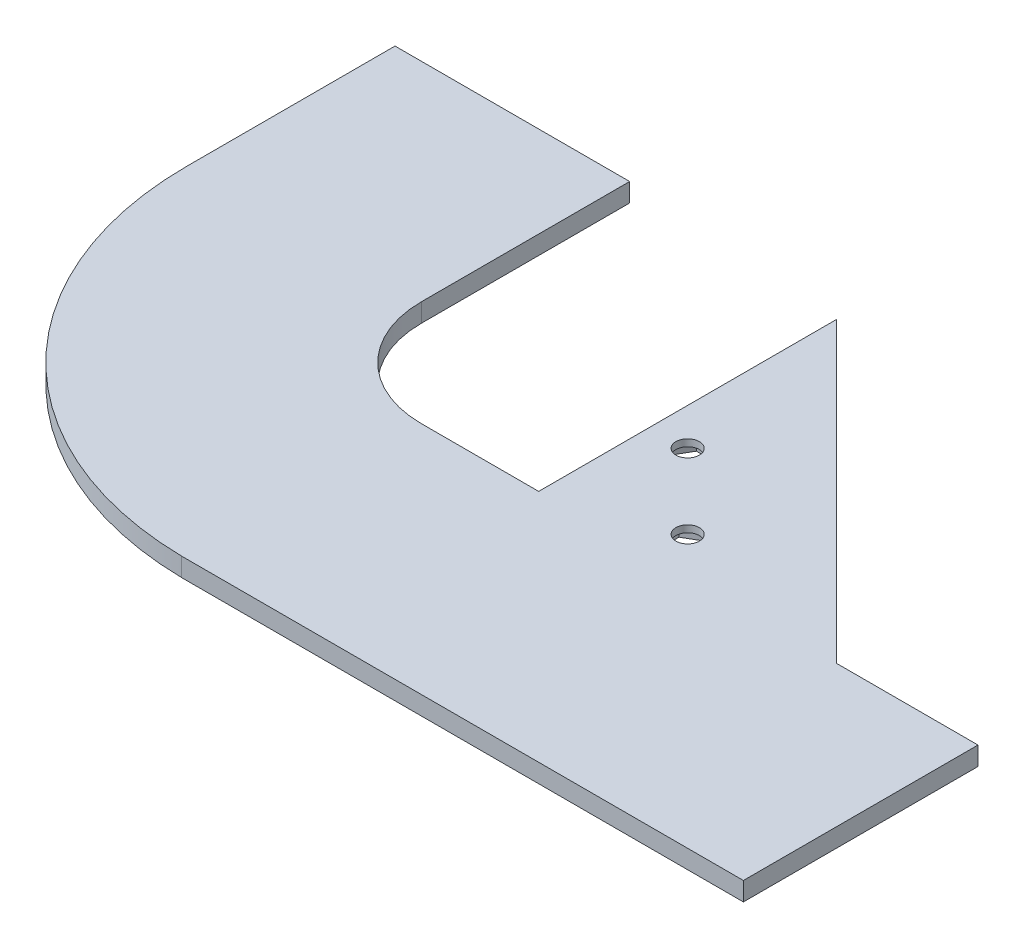
ISO-10303-21;
HEADER;
FILE_DESCRIPTION(('STEP AP214'),'2;1');
FILE_NAME('part.step','',(''),(''),'','','');
FILE_SCHEMA(('AUTOMOTIVE_DESIGN { 1 0 10303 214 1 1 1 1 }'));
ENDSEC;
DATA;
#1=APPLICATION_CONTEXT('core data for automotive mechanical design processes');
#2=APPLICATION_PROTOCOL_DEFINITION('international standard','automotive_design',2000,#1);
#3=PRODUCT_CONTEXT('',#1,'mechanical');
#4=PRODUCT('Part','Part','',(#3));
#5=PRODUCT_RELATED_PRODUCT_CATEGORY('part','',(#4));
#6=PRODUCT_DEFINITION_FORMATION('','',#4);
#7=PRODUCT_DEFINITION_CONTEXT('part definition',#1,'design');
#8=PRODUCT_DEFINITION('design','',#6,#7);
#9=PRODUCT_DEFINITION_SHAPE('','',#8);
#10=(LENGTH_UNIT() NAMED_UNIT(*) SI_UNIT(.MILLI.,.METRE.));
#11=(NAMED_UNIT(*) PLANE_ANGLE_UNIT() SI_UNIT($,.RADIAN.));
#12=(NAMED_UNIT(*) SI_UNIT($,.STERADIAN.) SOLID_ANGLE_UNIT());
#13=UNCERTAINTY_MEASURE_WITH_UNIT(LENGTH_MEASURE(1.E-05),#10,'distance_accuracy_value','');
#14=(GEOMETRIC_REPRESENTATION_CONTEXT(3) GLOBAL_UNCERTAINTY_ASSIGNED_CONTEXT((#13)) GLOBAL_UNIT_ASSIGNED_CONTEXT((#10,
#11,#12)) REPRESENTATION_CONTEXT('',''));
#15=CARTESIAN_POINT('',(0.,0.,0.));
#16=DIRECTION('',(0.,0.,1.));
#17=DIRECTION('',(1.,0.,0.));
#18=AXIS2_PLACEMENT_3D('',#15,#16,#17);
#19=CARTESIAN_POINT('',(0.,0.,0.));
#20=DIRECTION('',(0.,-1.,0.));
#21=DIRECTION('',(0.,0.,-1.));
#22=AXIS2_PLACEMENT_3D('',#19,#20,#21);
#23=PLANE('',#22);
#24=DIRECTION('',(-0.5,0.,-0.866025403784439));
#25=VECTOR('',#24,1.);
#26=CARTESIAN_POINT('',(9.98030738792827,0.,-5.76213315701559));
#27=LINE('',#26,#25);
#28=CARTESIAN_POINT('',(4.32927694458767,0.,-15.550005));
#29=VERTEX_POINT('',#28);
#30=CARTESIAN_POINT('',(2.30855388917533,0.,-19.05));
#31=VERTEX_POINT('',#30);
#32=EDGE_CURVE('E64',#29,#31,#27,.T.);
#33=ORIENTED_EDGE('',*,*,#32,.F.);
#34=DIRECTION('',(-1.,0.,0.));
#35=VECTOR('',#34,1.);
#36=CARTESIAN_POINT('',(0.,0.,-15.550005));
#37=LINE('',#36,#35);
#38=CARTESIAN_POINT('',(8.37072305541236,0.,-15.550005));
#39=VERTEX_POINT('',#38);
#40=EDGE_CURVE('E292',#39,#29,#37,.T.);
#41=ORIENTED_EDGE('',*,*,#40,.F.);
#42=DIRECTION('',(-0.5,0.,0.866025403784439));
#43=VECTOR('',#42,1.);
#44=CARTESIAN_POINT('',(-0.455307387928245,0.,-0.262871842984397));
#45=LINE('',#44,#43);
#46=CARTESIAN_POINT('',(10.3914461108247,0.,-19.05));
#47=VERTEX_POINT('',#46);
#48=EDGE_CURVE('E318',#47,#39,#45,.T.);
#49=ORIENTED_EDGE('',*,*,#48,.F.);
#50=DIRECTION('',(0.5,0.,0.866025403784439));
#51=VECTOR('',#50,1.);
#52=CARTESIAN_POINT('',(16.0424765541653,0.,-9.26212815701559));
#53=LINE('',#52,#51);
#54=CARTESIAN_POINT('',(8.37072305541236,0.,-22.549995));
#55=VERTEX_POINT('',#54);
#56=EDGE_CURVE('E315',#55,#47,#53,.T.);
#57=ORIENTED_EDGE('',*,*,#56,.F.);
#58=DIRECTION('',(1.,0.,0.));
#59=VECTOR('',#58,1.);
#60=CARTESIAN_POINT('',(0.,0.,-22.549995));
#61=LINE('',#60,#59);
#62=CARTESIAN_POINT('',(4.32927694458767,0.,-22.549995));
#63=VERTEX_POINT('',#62);
#64=EDGE_CURVE('E312',#63,#55,#61,.T.);
#65=ORIENTED_EDGE('',*,*,#64,.F.);
#66=DIRECTION('',(0.5,0.,-0.866025403784439));
#67=VECTOR('',#66,1.);
#68=CARTESIAN_POINT('',(-6.51747655416529,0.,-3.7628668429844));
#69=LINE('',#68,#67);
#70=EDGE_CURVE('E309',#31,#63,#69,.T.);
#71=ORIENTED_EDGE('',*,*,#70,.F.);
#72=EDGE_LOOP('',(#33,#41,#49,#57,#65,#71));
#73=FACE_BOUND('',#72,.T.);
#74=DIRECTION('',(-0.707106781186547,0.,-0.707106781186547));
#75=VECTOR('',#74,1.);
#76=CARTESIAN_POINT('',(50.8,0.,0.));
#77=LINE('',#76,#75);
#78=CARTESIAN_POINT('',(50.8,0.,0.));
#79=VERTEX_POINT('',#78);
#80=CARTESIAN_POINT('',(0.,0.,-50.8));
#81=VERTEX_POINT('',#80);
#82=EDGE_CURVE('E378',#79,#81,#77,.T.);
#83=ORIENTED_EDGE('',*,*,#82,.F.);
#84=DIRECTION('',(1.,0.,0.));
#85=VECTOR('',#84,1.);
#86=CARTESIAN_POINT('',(0.,0.,0.));
#87=LINE('',#86,#85);
#88=CARTESIAN_POINT('',(74.9046354694396,0.,0.));
#89=VERTEX_POINT('',#88);
#90=EDGE_CURVE('E254',#79,#89,#87,.T.);
#91=ORIENTED_EDGE('',*,*,#90,.T.);
#92=DIRECTION('',(0.,0.,1.));
#93=VECTOR('',#92,1.);
#94=CARTESIAN_POINT('',(74.9046354694396,0.,0.));
#95=LINE('',#94,#93);
#96=CARTESIAN_POINT('',(74.9046354694396,0.,40.));
#97=VERTEX_POINT('',#96);
#98=EDGE_CURVE('E223',#89,#97,#95,.T.);
#99=ORIENTED_EDGE('',*,*,#98,.T.);
#100=DIRECTION('',(-1.,0.,0.));
#101=VECTOR('',#100,1.);
#102=CARTESIAN_POINT('',(74.9046354694396,0.,40.));
#103=LINE('',#102,#101);
#104=CARTESIAN_POINT('',(-20.8712492348,0.,40.));
#105=VERTEX_POINT('',#104);
#106=EDGE_CURVE('E256',#97,#105,#103,.T.);
#107=ORIENTED_EDGE('',*,*,#106,.T.);
#108=CARTESIAN_POINT('',(-20.,0.,-18.));
#109=DIRECTION('',(0.,-1.,0.));
#110=DIRECTION('',(0.,0.,-1.));
#111=AXIS2_PLACEMENT_3D('',#108,#109,#110);
#112=CIRCLE('',#111,58.0065433828731);
#113=CARTESIAN_POINT('',(-78.0065433828731,0.,-18.));
#114=VERTEX_POINT('',#113);
#115=EDGE_CURVE('E259',#105,#114,#112,.T.);
#116=ORIENTED_EDGE('',*,*,#115,.T.);
#117=DIRECTION('',(0.,0.,-1.));
#118=VECTOR('',#117,1.);
#119=CARTESIAN_POINT('',(-78.0065433828731,0.,-53.5115102389505));
#120=LINE('',#119,#118);
#121=CARTESIAN_POINT('',(-78.0065433828731,0.,-53.5115102389505));
#122=VERTEX_POINT('',#121);
#123=EDGE_CURVE('E262',#114,#122,#120,.T.);
#124=ORIENTED_EDGE('',*,*,#123,.T.);
#125=DIRECTION('',(1.,0.,0.));
#126=VECTOR('',#125,1.);
#127=CARTESIAN_POINT('',(-38.,0.,-53.5115102389505));
#128=LINE('',#127,#126);
#129=CARTESIAN_POINT('',(-38.,0.,-53.5115102389505));
#130=VERTEX_POINT('',#129);
#131=EDGE_CURVE('E265',#122,#130,#128,.T.);
#132=ORIENTED_EDGE('',*,*,#131,.T.);
#133=DIRECTION('',(0.,0.,1.));
#134=VECTOR('',#133,1.);
#135=CARTESIAN_POINT('',(-38.,0.,-18.));
#136=LINE('',#135,#134);
#137=CARTESIAN_POINT('',(-38.,0.,-18.));
#138=VERTEX_POINT('',#137);
#139=EDGE_CURVE('E268',#130,#138,#136,.T.);
#140=ORIENTED_EDGE('',*,*,#139,.T.);
#141=CARTESIAN_POINT('',(-20.,0.,-18.));
#142=DIRECTION('',(0.,1.,0.));
#143=DIRECTION('',(0.,0.,-1.));
#144=AXIS2_PLACEMENT_3D('',#141,#142,#143);
#145=CIRCLE('',#144,18.);
#146=CARTESIAN_POINT('',(-20.,0.,0.));
#147=VERTEX_POINT('',#146);
#148=EDGE_CURVE('E216',#138,#147,#145,.T.);
#149=ORIENTED_EDGE('',*,*,#148,.T.);
#150=CARTESIAN_POINT('',(0.,0.,0.));
#151=VERTEX_POINT('',#150);
#152=EDGE_CURVE('E251',#147,#151,#87,.T.);
#153=ORIENTED_EDGE('',*,*,#152,.T.);
#154=DIRECTION('',(0.,0.,1.));
#155=VECTOR('',#154,1.);
#156=CARTESIAN_POINT('',(0.,0.,-50.8));
#157=LINE('',#156,#155);
#158=EDGE_CURVE('E385',#81,#151,#157,.T.);
#159=ORIENTED_EDGE('',*,*,#158,.F.);
#160=EDGE_LOOP('',(#83,#91,#99,#107,#116,#124,#132,#140,#149,#153,#159));
#161=FACE_BOUND('',#160,.T.);
#162=DIRECTION('',(0.,0.,1.));
#163=VECTOR('',#162,1.);
#164=CARTESIAN_POINT('',(15.550005,0.,0.));
#165=LINE('',#164,#163);
#166=CARTESIAN_POINT('',(15.550005,0.,-8.37072305541237));
#167=VERTEX_POINT('',#166);
#168=CARTESIAN_POINT('',(15.550005,0.,-4.32927694458767));
#169=VERTEX_POINT('',#168);
#170=EDGE_CURVE('E347',#167,#169,#165,.T.);
#171=ORIENTED_EDGE('',*,*,#170,.T.);
#172=DIRECTION('',(0.866025403784439,0.,0.499999999999999));
#173=VECTOR('',#172,1.);
#174=CARTESIAN_POINT('',(5.76213315701559,0.,-9.98030738792827));
#175=LINE('',#174,#173);
#176=CARTESIAN_POINT('',(19.05,0.,-2.30855388917533));
#177=VERTEX_POINT('',#176);
#178=EDGE_CURVE('E72',#169,#177,#175,.T.);
#179=ORIENTED_EDGE('',*,*,#178,.T.);
#180=DIRECTION('',(0.866025403784439,0.,-0.499999999999999));
#181=VECTOR('',#180,1.);
#182=CARTESIAN_POINT('',(3.76286684298438,0.,6.51747655416526));
#183=LINE('',#182,#181);
#184=CARTESIAN_POINT('',(22.549995,0.,-4.32927694458767));
#185=VERTEX_POINT('',#184);
#186=EDGE_CURVE('E360',#177,#185,#183,.T.);
#187=ORIENTED_EDGE('',*,*,#186,.T.);
#188=DIRECTION('',(0.,0.,-1.));
#189=VECTOR('',#188,1.);
#190=CARTESIAN_POINT('',(22.549995,0.,0.));
#191=LINE('',#190,#189);
#192=CARTESIAN_POINT('',(22.549995,0.,-8.37072305541236));
#193=VERTEX_POINT('',#192);
#194=EDGE_CURVE('E357',#185,#193,#191,.T.);
#195=ORIENTED_EDGE('',*,*,#194,.T.);
#196=DIRECTION('',(-0.866025403784439,0.,-0.5));
#197=VECTOR('',#196,1.);
#198=CARTESIAN_POINT('',(9.26212815701559,0.,-16.0424765541653));
#199=LINE('',#198,#197);
#200=CARTESIAN_POINT('',(19.05,0.,-10.3914461108247));
#201=VERTEX_POINT('',#200);
#202=EDGE_CURVE('E354',#193,#201,#199,.T.);
#203=ORIENTED_EDGE('',*,*,#202,.T.);
#204=DIRECTION('',(-0.866025403784439,0.,0.5));
#205=VECTOR('',#204,1.);
#206=CARTESIAN_POINT('',(0.262871842984393,0.,0.455307387928238));
#207=LINE('',#206,#205);
#208=EDGE_CURVE('E350',#201,#167,#207,.T.);
#209=ORIENTED_EDGE('',*,*,#208,.T.);
#210=EDGE_LOOP('',(#171,#179,#187,#195,#203,#209));
#211=FACE_BOUND('',#210,.T.);
#212=ADVANCED_FACE('F47',(#73,#161,#211),#23,.T.);
#213=CARTESIAN_POINT('',(6.35000000000002,0.,-19.05));
#214=DIRECTION('',(0.,1.,0.));
#215=DIRECTION('',(0.,0.,1.));
#216=AXIS2_PLACEMENT_3D('',#213,#214,#215);
#217=CYLINDRICAL_SURFACE('',#216,2.00000000000001);
#218=CARTESIAN_POINT('',(6.35000000000002,3.175,-19.05));
#219=DIRECTION('',(0.,-1.,0.));
#220=DIRECTION('',(0.,0.,-1.));
#221=AXIS2_PLACEMENT_3D('',#218,#219,#220);
#222=CIRCLE('',#221,2.00000000000001);
#223=CARTESIAN_POINT('',(6.35000000000002,3.175,-21.05));
#224=VERTEX_POINT('',#223);
#225=EDGE_CURVE('E379',#224,#224,#222,.T.);
#226=ORIENTED_EDGE('',*,*,#225,.F.);
#227=EDGE_LOOP('',(#226));
#228=FACE_BOUND('',#227,.T.);
#229=CARTESIAN_POINT('',(6.35000000000002,2.,-19.05));
#230=DIRECTION('',(0.,-1.,0.));
#231=DIRECTION('',(0.,0.,-1.));
#232=AXIS2_PLACEMENT_3D('',#229,#230,#231);
#233=CIRCLE('',#232,2.00000000000001);
#234=CARTESIAN_POINT('',(6.35000000000002,2.,-21.05));
#235=VERTEX_POINT('',#234);
#236=EDGE_CURVE('E51',#235,#235,#233,.T.);
#237=ORIENTED_EDGE('',*,*,#236,.T.);
#238=EDGE_LOOP('',(#237));
#239=FACE_BOUND('',#238,.T.);
#240=ADVANCED_FACE('F399',(#228,#239),#217,.F.);
#241=CARTESIAN_POINT('',(0.,3.175,0.));
#242=DIRECTION('',(0.,-1.,0.));
#243=DIRECTION('',(0.,0.,-1.));
#244=AXIS2_PLACEMENT_3D('',#241,#242,#243);
#245=PLANE('',#244);
#246=DIRECTION('',(0.,0.,1.));
#247=VECTOR('',#246,1.);
#248=CARTESIAN_POINT('',(0.,3.175,-50.8));
#249=LINE('',#248,#247);
#250=CARTESIAN_POINT('',(0.,3.175,-50.8));
#251=VERTEX_POINT('',#250);
#252=CARTESIAN_POINT('',(0.,3.175,0.));
#253=VERTEX_POINT('',#252);
#254=EDGE_CURVE('E384',#251,#253,#249,.T.);
#255=ORIENTED_EDGE('',*,*,#254,.T.);
#256=DIRECTION('',(1.,0.,0.));
#257=VECTOR('',#256,1.);
#258=CARTESIAN_POINT('',(0.,3.175,0.));
#259=LINE('',#258,#257);
#260=CARTESIAN_POINT('',(-20.,3.175,0.));
#261=VERTEX_POINT('',#260);
#262=EDGE_CURVE('E215',#261,#253,#259,.T.);
#263=ORIENTED_EDGE('',*,*,#262,.F.);
#264=CARTESIAN_POINT('',(-20.,3.175,-18.));
#265=DIRECTION('',(0.,1.,0.));
#266=DIRECTION('',(0.,0.,-1.));
#267=AXIS2_PLACEMENT_3D('',#264,#265,#266);
#268=CIRCLE('',#267,18.);
#269=CARTESIAN_POINT('',(-38.,3.175,-18.));
#270=VERTEX_POINT('',#269);
#271=EDGE_CURVE('E225',#270,#261,#268,.T.);
#272=ORIENTED_EDGE('',*,*,#271,.F.);
#273=DIRECTION('',(0.,0.,1.));
#274=VECTOR('',#273,1.);
#275=CARTESIAN_POINT('',(-38.,3.175,-18.));
#276=LINE('',#275,#274);
#277=CARTESIAN_POINT('',(-38.,3.175,-53.5115102389505));
#278=VERTEX_POINT('',#277);
#279=EDGE_CURVE('E246',#278,#270,#276,.T.);
#280=ORIENTED_EDGE('',*,*,#279,.F.);
#281=DIRECTION('',(1.,0.,0.));
#282=VECTOR('',#281,1.);
#283=CARTESIAN_POINT('',(-38.,3.175,-53.5115102389505));
#284=LINE('',#283,#282);
#285=CARTESIAN_POINT('',(-78.0065433828731,3.175,-53.5115102389505));
#286=VERTEX_POINT('',#285);
#287=EDGE_CURVE('E243',#286,#278,#284,.T.);
#288=ORIENTED_EDGE('',*,*,#287,.F.);
#289=DIRECTION('',(0.,0.,-1.));
#290=VECTOR('',#289,1.);
#291=CARTESIAN_POINT('',(-78.0065433828731,3.175,-53.5115102389505));
#292=LINE('',#291,#290);
#293=CARTESIAN_POINT('',(-78.0065433828731,3.175,-18.));
#294=VERTEX_POINT('',#293);
#295=EDGE_CURVE('E240',#294,#286,#292,.T.);
#296=ORIENTED_EDGE('',*,*,#295,.F.);
#297=CARTESIAN_POINT('',(-20.,3.175,-18.));
#298=DIRECTION('',(0.,-1.,0.));
#299=DIRECTION('',(0.,0.,-1.));
#300=AXIS2_PLACEMENT_3D('',#297,#298,#299);
#301=CIRCLE('',#300,58.0065433828731);
#302=CARTESIAN_POINT('',(-20.8712492348,3.175,40.));
#303=VERTEX_POINT('',#302);
#304=EDGE_CURVE('E234',#303,#294,#301,.T.);
#305=ORIENTED_EDGE('',*,*,#304,.F.);
#306=DIRECTION('',(-1.,0.,0.));
#307=VECTOR('',#306,1.);
#308=CARTESIAN_POINT('',(74.9046354694396,3.175,40.));
#309=LINE('',#308,#307);
#310=CARTESIAN_POINT('',(74.9046354694396,3.175,40.));
#311=VERTEX_POINT('',#310);
#312=EDGE_CURVE('E232',#311,#303,#309,.T.);
#313=ORIENTED_EDGE('',*,*,#312,.F.);
#314=DIRECTION('',(0.,0.,1.));
#315=VECTOR('',#314,1.);
#316=CARTESIAN_POINT('',(74.9046354694396,3.175,0.));
#317=LINE('',#316,#315);
#318=CARTESIAN_POINT('',(74.9046354694396,3.175,0.));
#319=VERTEX_POINT('',#318);
#320=EDGE_CURVE('E221',#319,#311,#317,.T.);
#321=ORIENTED_EDGE('',*,*,#320,.F.);
#322=CARTESIAN_POINT('',(50.8,3.175,0.));
#323=VERTEX_POINT('',#322);
#324=EDGE_CURVE('E207',#323,#319,#259,.T.);
#325=ORIENTED_EDGE('',*,*,#324,.F.);
#326=DIRECTION('',(-0.707106781186547,0.,-0.707106781186547));
#327=VECTOR('',#326,1.);
#328=CARTESIAN_POINT('',(50.8,3.175,0.));
#329=LINE('',#328,#327);
#330=EDGE_CURVE('E382',#323,#251,#329,.T.);
#331=ORIENTED_EDGE('',*,*,#330,.T.);
#332=EDGE_LOOP('',(#255,#263,#272,#280,#288,#296,#305,#313,#321,#325,#331));
#333=FACE_BOUND('',#332,.T.);
#334=ORIENTED_EDGE('',*,*,#225,.T.);
#335=EDGE_LOOP('',(#334));
#336=FACE_BOUND('',#335,.T.);
#337=CARTESIAN_POINT('',(19.05,3.175,-6.35));
#338=DIRECTION('',(0.,1.,0.));
#339=DIRECTION('',(0.,0.,1.));
#340=AXIS2_PLACEMENT_3D('',#337,#338,#339);
#341=CIRCLE('',#340,2.);
#342=CARTESIAN_POINT('',(19.05,3.175,-4.35));
#343=VERTEX_POINT('',#342);
#344=EDGE_CURVE('E375',#343,#343,#341,.T.);
#345=ORIENTED_EDGE('',*,*,#344,.F.);
#346=EDGE_LOOP('',(#345));
#347=FACE_BOUND('',#346,.T.);
#348=ADVANCED_FACE('F228',(#333,#336,#347),#245,.F.);
#349=CARTESIAN_POINT('',(50.8,3.175,0.));
#350=DIRECTION('',(-0.707106781186548,0.,0.707106781186548));
#351=DIRECTION('',(0.707106781186548,0.,0.707106781186548));
#352=AXIS2_PLACEMENT_3D('',#349,#350,#351);
#353=PLANE('',#352);
#354=ORIENTED_EDGE('',*,*,#82,.T.);
#355=DIRECTION('',(0.,-1.,0.));
#356=VECTOR('',#355,1.);
#357=CARTESIAN_POINT('',(0.,3.175,-50.8));
#358=LINE('',#357,#356);
#359=EDGE_CURVE('E56',#251,#81,#358,.T.);
#360=ORIENTED_EDGE('',*,*,#359,.F.);
#361=ORIENTED_EDGE('',*,*,#330,.F.);
#362=DIRECTION('',(0.,-1.,0.));
#363=VECTOR('',#362,1.);
#364=CARTESIAN_POINT('',(50.8,3.175,0.));
#365=LINE('',#364,#363);
#366=EDGE_CURVE('E11',#323,#79,#365,.T.);
#367=ORIENTED_EDGE('',*,*,#366,.T.);
#368=EDGE_LOOP('',(#354,#360,#361,#367));
#369=FACE_BOUND('',#368,.T.);
#370=ADVANCED_FACE('F49',(#369),#353,.F.);
#371=CARTESIAN_POINT('',(0.,3.175,-50.8));
#372=DIRECTION('',(1.,0.,0.));
#373=DIRECTION('',(0.,0.,-1.));
#374=AXIS2_PLACEMENT_3D('',#371,#372,#373);
#375=PLANE('',#374);
#376=ORIENTED_EDGE('',*,*,#158,.T.);
#377=DIRECTION('',(0.,-1.,0.));
#378=VECTOR('',#377,1.);
#379=CARTESIAN_POINT('',(0.,3.175,0.));
#380=LINE('',#379,#378);
#381=EDGE_CURVE('E387',#253,#151,#380,.T.);
#382=ORIENTED_EDGE('',*,*,#381,.F.);
#383=ORIENTED_EDGE('',*,*,#254,.F.);
#384=ORIENTED_EDGE('',*,*,#359,.T.);
#385=EDGE_LOOP('',(#376,#382,#383,#384));
#386=FACE_BOUND('',#385,.T.);
#387=ADVANCED_FACE('F476',(#386),#375,.F.);
#388=CARTESIAN_POINT('',(19.05,0.,-6.35));
#389=DIRECTION('',(0.,1.,0.));
#390=DIRECTION('',(0.,0.,1.));
#391=AXIS2_PLACEMENT_3D('',#388,#389,#390);
#392=CYLINDRICAL_SURFACE('',#391,2.);
#393=CARTESIAN_POINT('',(19.05,2.,-6.35));
#394=DIRECTION('',(0.,1.,0.));
#395=DIRECTION('',(0.,0.,1.));
#396=AXIS2_PLACEMENT_3D('',#393,#394,#395);
#397=CIRCLE('',#396,2.);
#398=CARTESIAN_POINT('',(19.05,2.,-4.35));
#399=VERTEX_POINT('',#398);
#400=EDGE_CURVE('E325',#399,#399,#397,.F.);
#401=ORIENTED_EDGE('',*,*,#400,.T.);
#402=EDGE_LOOP('',(#401));
#403=FACE_BOUND('',#402,.T.);
#404=ORIENTED_EDGE('',*,*,#344,.T.);
#405=EDGE_LOOP('',(#404));
#406=FACE_BOUND('',#405,.T.);
#407=ADVANCED_FACE('F473',(#403,#406),#392,.F.);
#408=CARTESIAN_POINT('',(0.,2.,0.));
#409=DIRECTION('',(0.,1.,0.));
#410=DIRECTION('',(0.,0.,1.));
#411=AXIS2_PLACEMENT_3D('',#408,#409,#410);
#412=PLANE('',#411);
#413=DIRECTION('',(0.866025403784439,0.,0.499999999999999));
#414=VECTOR('',#413,1.);
#415=CARTESIAN_POINT('',(5.76213315701559,2.,-9.98030738792827));
#416=LINE('',#415,#414);
#417=CARTESIAN_POINT('',(15.550005,2.,-4.32927694458767));
#418=VERTEX_POINT('',#417);
#419=CARTESIAN_POINT('',(19.05,2.,-2.30855388917533));
#420=VERTEX_POINT('',#419);
#421=EDGE_CURVE('E351',#418,#420,#416,.T.);
#422=ORIENTED_EDGE('',*,*,#421,.F.);
#423=DIRECTION('',(0.,0.,1.));
#424=VECTOR('',#423,1.);
#425=CARTESIAN_POINT('',(15.550005,2.,0.));
#426=LINE('',#425,#424);
#427=CARTESIAN_POINT('',(15.550005,2.,-8.37072305541237));
#428=VERTEX_POINT('',#427);
#429=EDGE_CURVE('E346',#428,#418,#426,.T.);
#430=ORIENTED_EDGE('',*,*,#429,.F.);
#431=DIRECTION('',(-0.866025403784439,0.,0.5));
#432=VECTOR('',#431,1.);
#433=CARTESIAN_POINT('',(0.262871842984393,2.,0.455307387928238));
#434=LINE('',#433,#432);
#435=CARTESIAN_POINT('',(19.05,2.,-10.3914461108247));
#436=VERTEX_POINT('',#435);
#437=EDGE_CURVE('E365',#436,#428,#434,.T.);
#438=ORIENTED_EDGE('',*,*,#437,.F.);
#439=DIRECTION('',(-0.866025403784439,0.,-0.5));
#440=VECTOR('',#439,1.);
#441=CARTESIAN_POINT('',(9.26212815701559,2.,-16.0424765541653));
#442=LINE('',#441,#440);
#443=CARTESIAN_POINT('',(22.549995,2.,-8.37072305541236));
#444=VERTEX_POINT('',#443);
#445=EDGE_CURVE('E367',#444,#436,#442,.T.);
#446=ORIENTED_EDGE('',*,*,#445,.F.);
#447=DIRECTION('',(0.,0.,-1.));
#448=VECTOR('',#447,1.);
#449=CARTESIAN_POINT('',(22.549995,2.,0.));
#450=LINE('',#449,#448);
#451=CARTESIAN_POINT('',(22.549995,2.,-4.32927694458767));
#452=VERTEX_POINT('',#451);
#453=EDGE_CURVE('E369',#452,#444,#450,.T.);
#454=ORIENTED_EDGE('',*,*,#453,.F.);
#455=DIRECTION('',(0.866025403784439,0.,-0.499999999999999));
#456=VECTOR('',#455,1.);
#457=CARTESIAN_POINT('',(3.76286684298438,2.,6.51747655416526));
#458=LINE('',#457,#456);
#459=EDGE_CURVE('E371',#420,#452,#458,.T.);
#460=ORIENTED_EDGE('',*,*,#459,.F.);
#461=EDGE_LOOP('',(#422,#430,#438,#446,#454,#460));
#462=FACE_BOUND('',#461,.T.);
#463=ORIENTED_EDGE('',*,*,#400,.F.);
#464=EDGE_LOOP('',(#463));
#465=FACE_BOUND('',#464,.T.);
#466=ADVANCED_FACE('F443',(#462,#465),#412,.F.);
#467=CARTESIAN_POINT('',(5.76213315701559,2.,-9.98030738792827));
#468=DIRECTION('',(0.499999999999999,0.,-0.866025403784439));
#469=DIRECTION('',(-0.866025403784439,0.,-0.499999999999999));
#470=AXIS2_PLACEMENT_3D('',#467,#468,#469);
#471=PLANE('',#470);
#472=ORIENTED_EDGE('',*,*,#178,.F.);
#473=DIRECTION('',(0.,-1.,0.));
#474=VECTOR('',#473,1.);
#475=CARTESIAN_POINT('',(15.550005,2.,-4.32927694458767));
#476=LINE('',#475,#474);
#477=EDGE_CURVE('E344',#418,#169,#476,.T.);
#478=ORIENTED_EDGE('',*,*,#477,.F.);
#479=ORIENTED_EDGE('',*,*,#421,.T.);
#480=DIRECTION('',(0.,-1.,0.));
#481=VECTOR('',#480,1.);
#482=CARTESIAN_POINT('',(19.05,2.,-2.30855388917533));
#483=LINE('',#482,#481);
#484=EDGE_CURVE('E276',#420,#177,#483,.T.);
#485=ORIENTED_EDGE('',*,*,#484,.T.);
#486=EDGE_LOOP('',(#472,#478,#479,#485));
#487=FACE_BOUND('',#486,.T.);
#488=ADVANCED_FACE('F440',(#487),#471,.T.);
#489=CARTESIAN_POINT('',(3.76286684298438,2.,6.51747655416526));
#490=DIRECTION('',(-0.499999999999999,0.,-0.866025403784439));
#491=DIRECTION('',(-0.866025403784439,0.,0.499999999999999));
#492=AXIS2_PLACEMENT_3D('',#489,#490,#491);
#493=PLANE('',#492);
#494=ORIENTED_EDGE('',*,*,#186,.F.);
#495=ORIENTED_EDGE('',*,*,#484,.F.);
#496=ORIENTED_EDGE('',*,*,#459,.T.);
#497=DIRECTION('',(0.,-1.,0.));
#498=VECTOR('',#497,1.);
#499=CARTESIAN_POINT('',(22.549995,2.,-4.32927694458767));
#500=LINE('',#499,#498);
#501=EDGE_CURVE('E336',#452,#185,#500,.T.);
#502=ORIENTED_EDGE('',*,*,#501,.T.);
#503=EDGE_LOOP('',(#494,#495,#496,#502));
#504=FACE_BOUND('',#503,.T.);
#505=ADVANCED_FACE('F450',(#504),#493,.T.);
#506=CARTESIAN_POINT('',(22.549995,2.,0.));
#507=DIRECTION('',(-1.,0.,0.));
#508=DIRECTION('',(0.,0.,1.));
#509=AXIS2_PLACEMENT_3D('',#506,#507,#508);
#510=PLANE('',#509);
#511=ORIENTED_EDGE('',*,*,#194,.F.);
#512=ORIENTED_EDGE('',*,*,#501,.F.);
#513=ORIENTED_EDGE('',*,*,#453,.T.);
#514=DIRECTION('',(0.,-1.,0.));
#515=VECTOR('',#514,1.);
#516=CARTESIAN_POINT('',(22.549995,2.,-8.37072305541236));
#517=LINE('',#516,#515);
#518=EDGE_CURVE('E338',#444,#193,#517,.T.);
#519=ORIENTED_EDGE('',*,*,#518,.T.);
#520=EDGE_LOOP('',(#511,#512,#513,#519));
#521=FACE_BOUND('',#520,.T.);
#522=ADVANCED_FACE('F453',(#521),#510,.T.);
#523=CARTESIAN_POINT('',(9.26212815701559,2.,-16.0424765541653));
#524=DIRECTION('',(-0.5,0.,0.866025403784439));
#525=DIRECTION('',(0.866025403784439,0.,0.5));
#526=AXIS2_PLACEMENT_3D('',#523,#524,#525);
#527=PLANE('',#526);
#528=ORIENTED_EDGE('',*,*,#202,.F.);
#529=ORIENTED_EDGE('',*,*,#518,.F.);
#530=ORIENTED_EDGE('',*,*,#445,.T.);
#531=DIRECTION('',(0.,-1.,0.));
#532=VECTOR('',#531,1.);
#533=CARTESIAN_POINT('',(19.05,2.,-10.3914461108247));
#534=LINE('',#533,#532);
#535=EDGE_CURVE('E340',#436,#201,#534,.T.);
#536=ORIENTED_EDGE('',*,*,#535,.T.);
#537=EDGE_LOOP('',(#528,#529,#530,#536));
#538=FACE_BOUND('',#537,.T.);
#539=ADVANCED_FACE('F457',(#538),#527,.T.);
#540=CARTESIAN_POINT('',(0.262871842984393,2.,0.455307387928238));
#541=DIRECTION('',(0.5,0.,0.866025403784439));
#542=DIRECTION('',(0.866025403784439,0.,-0.5));
#543=AXIS2_PLACEMENT_3D('',#540,#541,#542);
#544=PLANE('',#543);
#545=ORIENTED_EDGE('',*,*,#208,.F.);
#546=ORIENTED_EDGE('',*,*,#535,.F.);
#547=ORIENTED_EDGE('',*,*,#437,.T.);
#548=DIRECTION('',(0.,-1.,0.));
#549=VECTOR('',#548,1.);
#550=CARTESIAN_POINT('',(15.550005,2.,-8.37072305541237));
#551=LINE('',#550,#549);
#552=EDGE_CURVE('E342',#428,#167,#551,.T.);
#553=ORIENTED_EDGE('',*,*,#552,.T.);
#554=EDGE_LOOP('',(#545,#546,#547,#553));
#555=FACE_BOUND('',#554,.T.);
#556=ADVANCED_FACE('F460',(#555),#544,.T.);
#557=CARTESIAN_POINT('',(15.550005,2.,0.));
#558=DIRECTION('',(1.,0.,0.));
#559=DIRECTION('',(0.,0.,-1.));
#560=AXIS2_PLACEMENT_3D('',#557,#558,#559);
#561=PLANE('',#560);
#562=ORIENTED_EDGE('',*,*,#170,.F.);
#563=ORIENTED_EDGE('',*,*,#552,.F.);
#564=ORIENTED_EDGE('',*,*,#429,.T.);
#565=ORIENTED_EDGE('',*,*,#477,.T.);
#566=EDGE_LOOP('',(#562,#563,#564,#565));
#567=FACE_BOUND('',#566,.T.);
#568=ADVANCED_FACE('F437',(#567),#561,.T.);
#569=CARTESIAN_POINT('',(9.98030738792827,2.,-5.76213315701559));
#570=DIRECTION('',(-0.866025403784439,0.,0.5));
#571=DIRECTION('',(0.5,0.,0.866025403784439));
#572=AXIS2_PLACEMENT_3D('',#569,#570,#571);
#573=PLANE('',#572);
#574=ORIENTED_EDGE('',*,*,#32,.T.);
#575=DIRECTION('',(0.,-1.,0.));
#576=VECTOR('',#575,1.);
#577=CARTESIAN_POINT('',(2.30855388917533,2.,-19.05));
#578=LINE('',#577,#576);
#579=CARTESIAN_POINT('',(2.30855388917533,2.,-19.05));
#580=VERTEX_POINT('',#579);
#581=EDGE_CURVE('E307',#580,#31,#578,.T.);
#582=ORIENTED_EDGE('',*,*,#581,.F.);
#583=DIRECTION('',(-0.5,0.,-0.866025403784439));
#584=VECTOR('',#583,1.);
#585=CARTESIAN_POINT('',(9.98030738792827,2.,-5.76213315701559));
#586=LINE('',#585,#584);
#587=CARTESIAN_POINT('',(4.32927694458767,2.,-15.550005));
#588=VERTEX_POINT('',#587);
#589=EDGE_CURVE('E288',#588,#580,#586,.T.);
#590=ORIENTED_EDGE('',*,*,#589,.F.);
#591=DIRECTION('',(0.,-1.,0.));
#592=VECTOR('',#591,1.);
#593=CARTESIAN_POINT('',(4.32927694458767,2.,-15.550005));
#594=LINE('',#593,#592);
#595=EDGE_CURVE('E323',#588,#29,#594,.T.);
#596=ORIENTED_EDGE('',*,*,#595,.T.);
#597=EDGE_LOOP('',(#574,#582,#590,#596));
#598=FACE_BOUND('',#597,.T.);
#599=ADVANCED_FACE('F409',(#598),#573,.F.);
#600=CARTESIAN_POINT('',(0.,2.,-15.550005));
#601=DIRECTION('',(0.,0.,1.));
#602=DIRECTION('',(1.,0.,0.));
#603=AXIS2_PLACEMENT_3D('',#600,#601,#602);
#604=PLANE('',#603);
#605=ORIENTED_EDGE('',*,*,#40,.T.);
#606=ORIENTED_EDGE('',*,*,#595,.F.);
#607=DIRECTION('',(-1.,0.,0.));
#608=VECTOR('',#607,1.);
#609=CARTESIAN_POINT('',(0.,2.,-15.550005));
#610=LINE('',#609,#608);
#611=CARTESIAN_POINT('',(8.37072305541236,2.,-15.550005));
#612=VERTEX_POINT('',#611);
#613=EDGE_CURVE('E304',#612,#588,#610,.T.);
#614=ORIENTED_EDGE('',*,*,#613,.F.);
#615=DIRECTION('',(0.,-1.,0.));
#616=VECTOR('',#615,1.);
#617=CARTESIAN_POINT('',(8.37072305541236,2.,-15.550005));
#618=LINE('',#617,#616);
#619=EDGE_CURVE('E326',#612,#39,#618,.T.);
#620=ORIENTED_EDGE('',*,*,#619,.T.);
#621=EDGE_LOOP('',(#605,#606,#614,#620));
#622=FACE_BOUND('',#621,.T.);
#623=ADVANCED_FACE('F426',(#622),#604,.F.);
#624=CARTESIAN_POINT('',(-0.455307387928245,2.,-0.262871842984397));
#625=DIRECTION('',(0.866025403784439,0.,0.5));
#626=DIRECTION('',(0.5,0.,-0.866025403784439));
#627=AXIS2_PLACEMENT_3D('',#624,#625,#626);
#628=PLANE('',#627);
#629=ORIENTED_EDGE('',*,*,#48,.T.);
#630=ORIENTED_EDGE('',*,*,#619,.F.);
#631=DIRECTION('',(-0.5,0.,0.866025403784439));
#632=VECTOR('',#631,1.);
#633=CARTESIAN_POINT('',(-0.455307387928245,2.,-0.262871842984397));
#634=LINE('',#633,#632);
#635=CARTESIAN_POINT('',(10.3914461108247,2.,-19.05));
#636=VERTEX_POINT('',#635);
#637=EDGE_CURVE('E301',#636,#612,#634,.T.);
#638=ORIENTED_EDGE('',*,*,#637,.F.);
#639=DIRECTION('',(0.,-1.,0.));
#640=VECTOR('',#639,1.);
#641=CARTESIAN_POINT('',(10.3914461108247,2.,-19.05));
#642=LINE('',#641,#640);
#643=EDGE_CURVE('E328',#636,#47,#642,.T.);
#644=ORIENTED_EDGE('',*,*,#643,.T.);
#645=EDGE_LOOP('',(#629,#630,#638,#644));
#646=FACE_BOUND('',#645,.T.);
#647=ADVANCED_FACE('F423',(#646),#628,.F.);
#648=CARTESIAN_POINT('',(16.0424765541653,2.,-9.26212815701559));
#649=DIRECTION('',(0.866025403784439,0.,-0.5));
#650=DIRECTION('',(-0.5,0.,-0.866025403784439));
#651=AXIS2_PLACEMENT_3D('',#648,#649,#650);
#652=PLANE('',#651);
#653=ORIENTED_EDGE('',*,*,#56,.T.);
#654=ORIENTED_EDGE('',*,*,#643,.F.);
#655=DIRECTION('',(0.5,0.,0.866025403784439));
#656=VECTOR('',#655,1.);
#657=CARTESIAN_POINT('',(16.0424765541653,2.,-9.26212815701559));
#658=LINE('',#657,#656);
#659=CARTESIAN_POINT('',(8.37072305541236,2.,-22.549995));
#660=VERTEX_POINT('',#659);
#661=EDGE_CURVE('E298',#660,#636,#658,.T.);
#662=ORIENTED_EDGE('',*,*,#661,.F.);
#663=DIRECTION('',(0.,-1.,0.));
#664=VECTOR('',#663,1.);
#665=CARTESIAN_POINT('',(8.37072305541236,2.,-22.549995));
#666=LINE('',#665,#664);
#667=EDGE_CURVE('E330',#660,#55,#666,.T.);
#668=ORIENTED_EDGE('',*,*,#667,.T.);
#669=EDGE_LOOP('',(#653,#654,#662,#668));
#670=FACE_BOUND('',#669,.T.);
#671=ADVANCED_FACE('F419',(#670),#652,.F.);
#672=CARTESIAN_POINT('',(0.,2.,-22.549995));
#673=DIRECTION('',(0.,0.,-1.));
#674=DIRECTION('',(-1.,0.,0.));
#675=AXIS2_PLACEMENT_3D('',#672,#673,#674);
#676=PLANE('',#675);
#677=ORIENTED_EDGE('',*,*,#64,.T.);
#678=ORIENTED_EDGE('',*,*,#667,.F.);
#679=DIRECTION('',(1.,0.,0.));
#680=VECTOR('',#679,1.);
#681=CARTESIAN_POINT('',(0.,2.,-22.549995));
#682=LINE('',#681,#680);
#683=CARTESIAN_POINT('',(4.32927694458767,2.,-22.549995));
#684=VERTEX_POINT('',#683);
#685=EDGE_CURVE('E295',#684,#660,#682,.T.);
#686=ORIENTED_EDGE('',*,*,#685,.F.);
#687=DIRECTION('',(0.,-1.,0.));
#688=VECTOR('',#687,1.);
#689=CARTESIAN_POINT('',(4.32927694458767,2.,-22.549995));
#690=LINE('',#689,#688);
#691=EDGE_CURVE('E332',#684,#63,#690,.T.);
#692=ORIENTED_EDGE('',*,*,#691,.T.);
#693=EDGE_LOOP('',(#677,#678,#686,#692));
#694=FACE_BOUND('',#693,.T.);
#695=ADVANCED_FACE('F415',(#694),#676,.F.);
#696=CARTESIAN_POINT('',(-6.51747655416529,2.,-3.7628668429844));
#697=DIRECTION('',(-0.866025403784439,0.,-0.5));
#698=DIRECTION('',(-0.5,0.,0.866025403784439));
#699=AXIS2_PLACEMENT_3D('',#696,#697,#698);
#700=PLANE('',#699);
#701=ORIENTED_EDGE('',*,*,#70,.T.);
#702=ORIENTED_EDGE('',*,*,#691,.F.);
#703=DIRECTION('',(0.5,0.,-0.866025403784439));
#704=VECTOR('',#703,1.);
#705=CARTESIAN_POINT('',(-6.51747655416529,2.,-3.7628668429844));
#706=LINE('',#705,#704);
#707=EDGE_CURVE('E291',#580,#684,#706,.T.);
#708=ORIENTED_EDGE('',*,*,#707,.F.);
#709=ORIENTED_EDGE('',*,*,#581,.T.);
#710=EDGE_LOOP('',(#701,#702,#708,#709));
#711=FACE_BOUND('',#710,.T.);
#712=ADVANCED_FACE('F404',(#711),#700,.F.);
#713=CARTESIAN_POINT('',(0.,2.,0.));
#714=DIRECTION('',(0.,-1.,0.));
#715=DIRECTION('',(0.,0.,-1.));
#716=AXIS2_PLACEMENT_3D('',#713,#714,#715);
#717=PLANE('',#716);
#718=ORIENTED_EDGE('',*,*,#236,.F.);
#719=EDGE_LOOP('',(#718));
#720=FACE_BOUND('',#719,.T.);
#721=ORIENTED_EDGE('',*,*,#589,.T.);
#722=ORIENTED_EDGE('',*,*,#707,.T.);
#723=ORIENTED_EDGE('',*,*,#685,.T.);
#724=ORIENTED_EDGE('',*,*,#661,.T.);
#725=ORIENTED_EDGE('',*,*,#637,.T.);
#726=ORIENTED_EDGE('',*,*,#613,.T.);
#727=EDGE_LOOP('',(#721,#722,#723,#724,#725,#726));
#728=FACE_BOUND('',#727,.T.);
#729=ADVANCED_FACE('F401',(#720,#728),#717,.T.);
#730=CARTESIAN_POINT('',(0.,3.175,0.));
#731=DIRECTION('',(0.,0.,-1.));
#732=DIRECTION('',(-1.,0.,0.));
#733=AXIS2_PLACEMENT_3D('',#730,#731,#732);
#734=PLANE('',#733);
#735=ORIENTED_EDGE('',*,*,#366,.F.);
#736=ORIENTED_EDGE('',*,*,#324,.T.);
#737=DIRECTION('',(0.,-1.,0.));
#738=VECTOR('',#737,1.);
#739=CARTESIAN_POINT('',(74.9046354694396,3.175,0.));
#740=LINE('',#739,#738);
#741=EDGE_CURVE('E211',#319,#89,#740,.T.);
#742=ORIENTED_EDGE('',*,*,#741,.T.);
#743=ORIENTED_EDGE('',*,*,#90,.F.);
#744=EDGE_LOOP('',(#735,#736,#742,#743));
#745=FACE_BOUND('',#744,.T.);
#746=ADVANCED_FACE('F209',(#745),#734,.T.);
#747=ORIENTED_EDGE('',*,*,#381,.T.);
#748=ORIENTED_EDGE('',*,*,#152,.F.);
#749=DIRECTION('',(0.,-1.,0.));
#750=VECTOR('',#749,1.);
#751=CARTESIAN_POINT('',(-20.,3.175,0.));
#752=LINE('',#751,#750);
#753=EDGE_CURVE('E273',#261,#147,#752,.T.);
#754=ORIENTED_EDGE('',*,*,#753,.F.);
#755=ORIENTED_EDGE('',*,*,#262,.T.);
#756=EDGE_LOOP('',(#747,#748,#754,#755));
#757=FACE_BOUND('',#756,.T.);
#758=ADVANCED_FACE('F492',(#757),#734,.T.);
#759=CARTESIAN_POINT('',(-20.,3.175,-18.));
#760=DIRECTION('',(0.,-1.,0.));
#761=DIRECTION('',(0.,0.,-1.));
#762=AXIS2_PLACEMENT_3D('',#759,#760,#761);
#763=CYLINDRICAL_SURFACE('',#762,18.);
#764=ORIENTED_EDGE('',*,*,#148,.F.);
#765=DIRECTION('',(0.,-1.,0.));
#766=VECTOR('',#765,1.);
#767=CARTESIAN_POINT('',(-38.,3.175,-18.));
#768=LINE('',#767,#766);
#769=EDGE_CURVE('E277',#270,#138,#768,.T.);
#770=ORIENTED_EDGE('',*,*,#769,.F.);
#771=ORIENTED_EDGE('',*,*,#271,.T.);
#772=ORIENTED_EDGE('',*,*,#753,.T.);
#773=EDGE_LOOP('',(#764,#770,#771,#772));
#774=FACE_BOUND('',#773,.T.);
#775=ADVANCED_FACE('F497',(#774),#763,.F.);
#776=CARTESIAN_POINT('',(-38.,3.175,-18.));
#777=DIRECTION('',(1.,0.,0.));
#778=DIRECTION('',(0.,0.,-1.));
#779=AXIS2_PLACEMENT_3D('',#776,#777,#778);
#780=PLANE('',#779);
#781=ORIENTED_EDGE('',*,*,#139,.F.);
#782=DIRECTION('',(0.,-1.,0.));
#783=VECTOR('',#782,1.);
#784=CARTESIAN_POINT('',(-38.,3.175,-53.5115102389505));
#785=LINE('',#784,#783);
#786=EDGE_CURVE('E279',#278,#130,#785,.T.);
#787=ORIENTED_EDGE('',*,*,#786,.F.);
#788=ORIENTED_EDGE('',*,*,#279,.T.);
#789=ORIENTED_EDGE('',*,*,#769,.T.);
#790=EDGE_LOOP('',(#781,#787,#788,#789));
#791=FACE_BOUND('',#790,.T.);
#792=ADVANCED_FACE('F515',(#791),#780,.T.);
#793=CARTESIAN_POINT('',(-38.,3.175,-53.5115102389505));
#794=DIRECTION('',(0.,0.,-1.));
#795=DIRECTION('',(-1.,0.,0.));
#796=AXIS2_PLACEMENT_3D('',#793,#794,#795);
#797=PLANE('',#796);
#798=ORIENTED_EDGE('',*,*,#131,.F.);
#799=DIRECTION('',(0.,-1.,0.));
#800=VECTOR('',#799,1.);
#801=CARTESIAN_POINT('',(-78.0065433828731,3.175,-53.5115102389505));
#802=LINE('',#801,#800);
#803=EDGE_CURVE('E281',#286,#122,#802,.T.);
#804=ORIENTED_EDGE('',*,*,#803,.F.);
#805=ORIENTED_EDGE('',*,*,#287,.T.);
#806=ORIENTED_EDGE('',*,*,#786,.T.);
#807=EDGE_LOOP('',(#798,#804,#805,#806));
#808=FACE_BOUND('',#807,.T.);
#809=ADVANCED_FACE('F512',(#808),#797,.T.);
#810=CARTESIAN_POINT('',(-78.0065433828731,3.175,-53.5115102389505));
#811=DIRECTION('',(-1.,0.,0.));
#812=DIRECTION('',(0.,0.,1.));
#813=AXIS2_PLACEMENT_3D('',#810,#811,#812);
#814=PLANE('',#813);
#815=ORIENTED_EDGE('',*,*,#123,.F.);
#816=DIRECTION('',(0.,-1.,0.));
#817=VECTOR('',#816,1.);
#818=CARTESIAN_POINT('',(-78.0065433828731,3.175,-18.));
#819=LINE('',#818,#817);
#820=EDGE_CURVE('E283',#294,#114,#819,.T.);
#821=ORIENTED_EDGE('',*,*,#820,.F.);
#822=ORIENTED_EDGE('',*,*,#295,.T.);
#823=ORIENTED_EDGE('',*,*,#803,.T.);
#824=EDGE_LOOP('',(#815,#821,#822,#823));
#825=FACE_BOUND('',#824,.T.);
#826=ADVANCED_FACE('F509',(#825),#814,.T.);
#827=CARTESIAN_POINT('',(-20.,3.175,-18.));
#828=DIRECTION('',(0.,-1.,0.));
#829=DIRECTION('',(0.,0.,-1.));
#830=AXIS2_PLACEMENT_3D('',#827,#828,#829);
#831=CYLINDRICAL_SURFACE('',#830,58.0065433828731);
#832=ORIENTED_EDGE('',*,*,#115,.F.);
#833=DIRECTION('',(0.,-1.,0.));
#834=VECTOR('',#833,1.);
#835=CARTESIAN_POINT('',(-20.8712492348,3.175,40.));
#836=LINE('',#835,#834);
#837=EDGE_CURVE('E285',#303,#105,#836,.T.);
#838=ORIENTED_EDGE('',*,*,#837,.F.);
#839=ORIENTED_EDGE('',*,*,#304,.T.);
#840=ORIENTED_EDGE('',*,*,#820,.T.);
#841=EDGE_LOOP('',(#832,#838,#839,#840));
#842=FACE_BOUND('',#841,.T.);
#843=ADVANCED_FACE('F505',(#842),#831,.T.);
#844=CARTESIAN_POINT('',(74.9046354694396,3.175,40.));
#845=DIRECTION('',(0.,0.,1.));
#846=DIRECTION('',(1.,0.,0.));
#847=AXIS2_PLACEMENT_3D('',#844,#845,#846);
#848=PLANE('',#847);
#849=ORIENTED_EDGE('',*,*,#106,.F.);
#850=DIRECTION('',(0.,-1.,0.));
#851=VECTOR('',#850,1.);
#852=CARTESIAN_POINT('',(74.9046354694396,3.175,40.));
#853=LINE('',#852,#851);
#854=EDGE_CURVE('E224',#311,#97,#853,.T.);
#855=ORIENTED_EDGE('',*,*,#854,.F.);
#856=ORIENTED_EDGE('',*,*,#312,.T.);
#857=ORIENTED_EDGE('',*,*,#837,.T.);
#858=EDGE_LOOP('',(#849,#855,#856,#857));
#859=FACE_BOUND('',#858,.T.);
#860=ADVANCED_FACE('F503',(#859),#848,.T.);
#861=CARTESIAN_POINT('',(74.9046354694396,3.175,0.));
#862=DIRECTION('',(1.,0.,0.));
#863=DIRECTION('',(0.,0.,-1.));
#864=AXIS2_PLACEMENT_3D('',#861,#862,#863);
#865=PLANE('',#864);
#866=ORIENTED_EDGE('',*,*,#98,.F.);
#867=ORIENTED_EDGE('',*,*,#741,.F.);
#868=ORIENTED_EDGE('',*,*,#320,.T.);
#869=ORIENTED_EDGE('',*,*,#854,.T.);
#870=EDGE_LOOP('',(#866,#867,#868,#869));
#871=FACE_BOUND('',#870,.T.);
#872=ADVANCED_FACE('F220',(#871),#865,.T.);
#873=CLOSED_SHELL('',(#212,#240,#348,#370,#387,#407,#466,#488,#505,#522,#539,#556,#568,#599,
#623,#647,#671,#695,#712,#729,#746,#758,#775,#792,#809,#826,#843,#860,#872));
#874=MANIFOLD_SOLID_BREP('B2',#873);
#875=ADVANCED_BREP_SHAPE_REPRESENTATION('',(#18,#874),#14);
#876=SHAPE_DEFINITION_REPRESENTATION(#9,#875);
ENDSEC;
END-ISO-10303-21;
